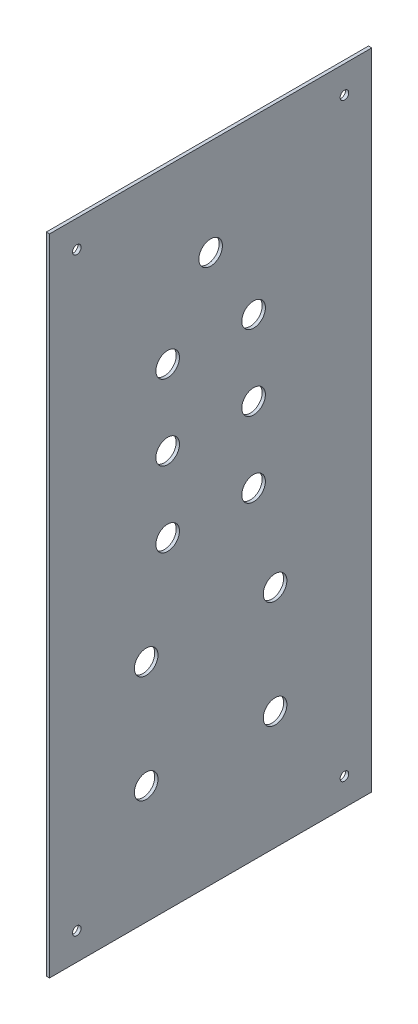
ISO-10303-21;
HEADER;
FILE_DESCRIPTION(('STEP AP214'),'2;1');
FILE_NAME('part.step','',(''),(''),'','','');
FILE_SCHEMA(('AUTOMOTIVE_DESIGN { 1 0 10303 214 1 1 1 1 }'));
ENDSEC;
DATA;
#1=APPLICATION_CONTEXT('core data for automotive mechanical design processes');
#2=APPLICATION_PROTOCOL_DEFINITION('international standard','automotive_design',2000,#1);
#3=PRODUCT_CONTEXT('',#1,'mechanical');
#4=PRODUCT('Part','Part','',(#3));
#5=PRODUCT_RELATED_PRODUCT_CATEGORY('part','',(#4));
#6=PRODUCT_DEFINITION_FORMATION('','',#4);
#7=PRODUCT_DEFINITION_CONTEXT('part definition',#1,'design');
#8=PRODUCT_DEFINITION('design','',#6,#7);
#9=PRODUCT_DEFINITION_SHAPE('','',#8);
#10=(LENGTH_UNIT() NAMED_UNIT(*) SI_UNIT(.MILLI.,.METRE.));
#11=(NAMED_UNIT(*) PLANE_ANGLE_UNIT() SI_UNIT($,.RADIAN.));
#12=(NAMED_UNIT(*) SI_UNIT($,.STERADIAN.) SOLID_ANGLE_UNIT());
#13=UNCERTAINTY_MEASURE_WITH_UNIT(LENGTH_MEASURE(1.E-05),#10,'distance_accuracy_value','');
#14=(GEOMETRIC_REPRESENTATION_CONTEXT(3) GLOBAL_UNCERTAINTY_ASSIGNED_CONTEXT((#13)) GLOBAL_UNIT_ASSIGNED_CONTEXT((#10,
#11,#12)) REPRESENTATION_CONTEXT('',''));
#15=CARTESIAN_POINT('',(0.,0.,0.));
#16=DIRECTION('',(0.,0.,1.));
#17=DIRECTION('',(1.,0.,0.));
#18=AXIS2_PLACEMENT_3D('',#15,#16,#17);
#19=CARTESIAN_POINT('',(0.,0.,0.));
#20=DIRECTION('',(-1.,0.,0.));
#21=DIRECTION('',(0.,0.,1.));
#22=AXIS2_PLACEMENT_3D('',#19,#20,#21);
#23=PLANE('',#22);
#24=CARTESIAN_POINT('',(0.,105.,0.));
#25=DIRECTION('',(1.,0.,0.));
#26=DIRECTION('',(0.,0.,-1.));
#27=AXIS2_PLACEMENT_3D('',#24,#25,#26);
#28=CIRCLE('',#27,5.50000000000001);
#29=CARTESIAN_POINT('',(0.,105.,-5.50000000000001));
#30=VERTEX_POINT('',#29);
#31=EDGE_CURVE('E204',#30,#30,#28,.T.);
#32=ORIENTED_EDGE('',*,*,#31,.T.);
#33=EDGE_LOOP('',(#32));
#34=FACE_BOUND('',#33,.T.);
#35=CARTESIAN_POINT('',(0.,0.,-20.));
#36=DIRECTION('',(1.,0.,0.));
#37=DIRECTION('',(0.,0.,-1.));
#38=AXIS2_PLACEMENT_3D('',#35,#36,#37);
#39=CIRCLE('',#38,5.5);
#40=CARTESIAN_POINT('',(0.,0.,-25.5));
#41=VERTEX_POINT('',#40);
#42=EDGE_CURVE('E199',#41,#41,#39,.T.);
#43=ORIENTED_EDGE('',*,*,#42,.T.);
#44=EDGE_LOOP('',(#43));
#45=FACE_BOUND('',#44,.T.);
#46=DIRECTION('',(0.,0.,1.));
#47=VECTOR('',#46,1.);
#48=CARTESIAN_POINT('',(0.,150.,-75.));
#49=LINE('',#48,#47);
#50=CARTESIAN_POINT('',(0.,150.,-75.));
#51=VERTEX_POINT('',#50);
#52=CARTESIAN_POINT('',(0.,150.,75.));
#53=VERTEX_POINT('',#52);
#54=EDGE_CURVE('E106',#51,#53,#49,.T.);
#55=ORIENTED_EDGE('',*,*,#54,.F.);
#56=DIRECTION('',(0.,1.,0.));
#57=VECTOR('',#56,1.);
#58=CARTESIAN_POINT('',(0.,-150.,-75.));
#59=LINE('',#58,#57);
#60=CARTESIAN_POINT('',(0.,-150.,-75.));
#61=VERTEX_POINT('',#60);
#62=EDGE_CURVE('E85',#61,#51,#59,.T.);
#63=ORIENTED_EDGE('',*,*,#62,.F.);
#64=DIRECTION('',(0.,0.,-1.));
#65=VECTOR('',#64,1.);
#66=CARTESIAN_POINT('',(0.,-150.,-75.));
#67=LINE('',#66,#65);
#68=CARTESIAN_POINT('',(0.,-150.,75.));
#69=VERTEX_POINT('',#68);
#70=EDGE_CURVE('E77',#69,#61,#67,.T.);
#71=ORIENTED_EDGE('',*,*,#70,.F.);
#72=DIRECTION('',(0.,-1.,0.));
#73=VECTOR('',#72,1.);
#74=CARTESIAN_POINT('',(0.,-150.,75.));
#75=LINE('',#74,#73);
#76=EDGE_CURVE('E96',#53,#69,#75,.T.);
#77=ORIENTED_EDGE('',*,*,#76,.F.);
#78=EDGE_LOOP('',(#55,#63,#71,#77));
#79=FACE_BOUND('',#78,.T.);
#80=CARTESIAN_POINT('',(0.,-137.3,62.3));
#81=DIRECTION('',(1.,0.,0.));
#82=DIRECTION('',(0.,0.,-1.));
#83=AXIS2_PLACEMENT_3D('',#80,#81,#82);
#84=CIRCLE('',#83,2.);
#85=CARTESIAN_POINT('',(0.,-137.3,60.3));
#86=VERTEX_POINT('',#85);
#87=EDGE_CURVE('E107',#86,#86,#84,.T.);
#88=ORIENTED_EDGE('',*,*,#87,.T.);
#89=EDGE_LOOP('',(#88));
#90=FACE_BOUND('',#89,.T.);
#91=CARTESIAN_POINT('',(0.,-137.3,-62.3));
#92=DIRECTION('',(1.,0.,0.));
#93=DIRECTION('',(0.,0.,-1.));
#94=AXIS2_PLACEMENT_3D('',#91,#92,#93);
#95=CIRCLE('',#94,2.);
#96=CARTESIAN_POINT('',(0.,-137.3,-64.3));
#97=VERTEX_POINT('',#96);
#98=EDGE_CURVE('E123',#97,#97,#95,.T.);
#99=ORIENTED_EDGE('',*,*,#98,.T.);
#100=EDGE_LOOP('',(#99));
#101=FACE_BOUND('',#100,.T.);
#102=CARTESIAN_POINT('',(0.,137.3,62.3));
#103=DIRECTION('',(1.,0.,0.));
#104=DIRECTION('',(0.,0.,-1.));
#105=AXIS2_PLACEMENT_3D('',#102,#103,#104);
#106=CIRCLE('',#105,2.);
#107=CARTESIAN_POINT('',(0.,137.3,60.3));
#108=VERTEX_POINT('',#107);
#109=EDGE_CURVE('E133',#108,#108,#106,.T.);
#110=ORIENTED_EDGE('',*,*,#109,.T.);
#111=EDGE_LOOP('',(#110));
#112=FACE_BOUND('',#111,.T.);
#113=CARTESIAN_POINT('',(0.,137.3,-62.3));
#114=DIRECTION('',(1.,0.,0.));
#115=DIRECTION('',(0.,0.,-1.));
#116=AXIS2_PLACEMENT_3D('',#113,#114,#115);
#117=CIRCLE('',#116,2.);
#118=CARTESIAN_POINT('',(0.,137.3,-64.3));
#119=VERTEX_POINT('',#118);
#120=EDGE_CURVE('E137',#119,#119,#117,.T.);
#121=ORIENTED_EDGE('',*,*,#120,.T.);
#122=EDGE_LOOP('',(#121));
#123=FACE_BOUND('',#122,.T.);
#124=CARTESIAN_POINT('',(0.,-45.,30.));
#125=DIRECTION('',(1.,0.,0.));
#126=DIRECTION('',(0.,0.,-1.));
#127=AXIS2_PLACEMENT_3D('',#124,#125,#126);
#128=CIRCLE('',#127,5.5);
#129=CARTESIAN_POINT('',(0.,-45.,24.5));
#130=VERTEX_POINT('',#129);
#131=EDGE_CURVE('E141',#130,#130,#128,.T.);
#132=ORIENTED_EDGE('',*,*,#131,.T.);
#133=EDGE_LOOP('',(#132));
#134=FACE_BOUND('',#133,.T.);
#135=CARTESIAN_POINT('',(0.,-95.,30.));
#136=DIRECTION('',(1.,0.,0.));
#137=DIRECTION('',(0.,0.,-1.));
#138=AXIS2_PLACEMENT_3D('',#135,#136,#137);
#139=CIRCLE('',#138,5.50000000000001);
#140=CARTESIAN_POINT('',(0.,-95.,24.5));
#141=VERTEX_POINT('',#140);
#142=EDGE_CURVE('E146',#141,#141,#139,.T.);
#143=ORIENTED_EDGE('',*,*,#142,.T.);
#144=EDGE_LOOP('',(#143));
#145=FACE_BOUND('',#144,.T.);
#146=CARTESIAN_POINT('',(0.,-45.,-30.));
#147=DIRECTION('',(1.,0.,0.));
#148=DIRECTION('',(0.,0.,-1.));
#149=AXIS2_PLACEMENT_3D('',#146,#147,#148);
#150=CIRCLE('',#149,5.5);
#151=CARTESIAN_POINT('',(0.,-45.,-35.5));
#152=VERTEX_POINT('',#151);
#153=EDGE_CURVE('E151',#152,#152,#150,.T.);
#154=ORIENTED_EDGE('',*,*,#153,.T.);
#155=EDGE_LOOP('',(#154));
#156=FACE_BOUND('',#155,.T.);
#157=CARTESIAN_POINT('',(0.,-95.,-30.));
#158=DIRECTION('',(1.,0.,0.));
#159=DIRECTION('',(0.,0.,-1.));
#160=AXIS2_PLACEMENT_3D('',#157,#158,#159);
#161=CIRCLE('',#160,5.50000000000001);
#162=CARTESIAN_POINT('',(0.,-95.,-35.5));
#163=VERTEX_POINT('',#162);
#164=EDGE_CURVE('E163',#163,#163,#161,.T.);
#165=ORIENTED_EDGE('',*,*,#164,.T.);
#166=EDGE_LOOP('',(#165));
#167=FACE_BOUND('',#166,.T.);
#168=CARTESIAN_POINT('',(0.,70.,20.));
#169=DIRECTION('',(1.,0.,0.));
#170=DIRECTION('',(0.,0.,-1.));
#171=AXIS2_PLACEMENT_3D('',#168,#169,#170);
#172=CIRCLE('',#171,5.50000000000001);
#173=CARTESIAN_POINT('',(0.,70.,14.5));
#174=VERTEX_POINT('',#173);
#175=EDGE_CURVE('E170',#174,#174,#172,.T.);
#176=ORIENTED_EDGE('',*,*,#175,.T.);
#177=EDGE_LOOP('',(#176));
#178=FACE_BOUND('',#177,.T.);
#179=CARTESIAN_POINT('',(0.,35.,20.));
#180=DIRECTION('',(1.,0.,0.));
#181=DIRECTION('',(0.,0.,-1.));
#182=AXIS2_PLACEMENT_3D('',#179,#180,#181);
#183=CIRCLE('',#182,5.5);
#184=CARTESIAN_POINT('',(0.,35.,14.5));
#185=VERTEX_POINT('',#184);
#186=EDGE_CURVE('E173',#185,#185,#183,.T.);
#187=ORIENTED_EDGE('',*,*,#186,.T.);
#188=EDGE_LOOP('',(#187));
#189=FACE_BOUND('',#188,.T.);
#190=CARTESIAN_POINT('',(0.,0.,20.));
#191=DIRECTION('',(1.,0.,0.));
#192=DIRECTION('',(0.,0.,-1.));
#193=AXIS2_PLACEMENT_3D('',#190,#191,#192);
#194=CIRCLE('',#193,5.5);
#195=CARTESIAN_POINT('',(0.,0.,14.5));
#196=VERTEX_POINT('',#195);
#197=EDGE_CURVE('E177',#196,#196,#194,.T.);
#198=ORIENTED_EDGE('',*,*,#197,.T.);
#199=EDGE_LOOP('',(#198));
#200=FACE_BOUND('',#199,.T.);
#201=CARTESIAN_POINT('',(0.,70.,-20.));
#202=DIRECTION('',(1.,0.,0.));
#203=DIRECTION('',(0.,0.,-1.));
#204=AXIS2_PLACEMENT_3D('',#201,#202,#203);
#205=CIRCLE('',#204,5.50000000000001);
#206=CARTESIAN_POINT('',(0.,70.,-25.5));
#207=VERTEX_POINT('',#206);
#208=EDGE_CURVE('E184',#207,#207,#205,.T.);
#209=ORIENTED_EDGE('',*,*,#208,.T.);
#210=EDGE_LOOP('',(#209));
#211=FACE_BOUND('',#210,.T.);
#212=CARTESIAN_POINT('',(0.,35.,-20.));
#213=DIRECTION('',(1.,0.,0.));
#214=DIRECTION('',(0.,0.,-1.));
#215=AXIS2_PLACEMENT_3D('',#212,#213,#214);
#216=CIRCLE('',#215,5.5);
#217=CARTESIAN_POINT('',(0.,35.,-25.5));
#218=VERTEX_POINT('',#217);
#219=EDGE_CURVE('E192',#218,#218,#216,.T.);
#220=ORIENTED_EDGE('',*,*,#219,.T.);
#221=EDGE_LOOP('',(#220));
#222=FACE_BOUND('',#221,.T.);
#223=ADVANCED_FACE('F45',(#34,#45,#79,#90,#101,#112,#123,#134,#145,#156,#167,#178,#189,#200,
#211,#222),#23,.T.);
#224=CARTESIAN_POINT('',(1.52,150.,-75.));
#225=DIRECTION('',(0.,-1.,0.));
#226=DIRECTION('',(0.,0.,-1.));
#227=AXIS2_PLACEMENT_3D('',#224,#225,#226);
#228=PLANE('',#227);
#229=ORIENTED_EDGE('',*,*,#54,.T.);
#230=DIRECTION('',(-1.,0.,0.));
#231=VECTOR('',#230,1.);
#232=CARTESIAN_POINT('',(1.52,150.,75.));
#233=LINE('',#232,#231);
#234=CARTESIAN_POINT('',(1.52,150.,75.));
#235=VERTEX_POINT('',#234);
#236=EDGE_CURVE('E11',#235,#53,#233,.T.);
#237=ORIENTED_EDGE('',*,*,#236,.F.);
#238=DIRECTION('',(0.,0.,1.));
#239=VECTOR('',#238,1.);
#240=CARTESIAN_POINT('',(1.52,150.,-75.));
#241=LINE('',#240,#239);
#242=CARTESIAN_POINT('',(1.52,150.,-75.));
#243=VERTEX_POINT('',#242);
#244=EDGE_CURVE('E93',#243,#235,#241,.T.);
#245=ORIENTED_EDGE('',*,*,#244,.F.);
#246=DIRECTION('',(-1.,0.,0.));
#247=VECTOR('',#246,1.);
#248=CARTESIAN_POINT('',(1.52,150.,-75.));
#249=LINE('',#248,#247);
#250=EDGE_CURVE('E105',#243,#51,#249,.T.);
#251=ORIENTED_EDGE('',*,*,#250,.T.);
#252=EDGE_LOOP('',(#229,#237,#245,#251));
#253=FACE_BOUND('',#252,.T.);
#254=ADVANCED_FACE('F42',(#253),#228,.F.);
#255=CARTESIAN_POINT('',(1.52,-150.,75.));
#256=DIRECTION('',(0.,0.,-1.));
#257=DIRECTION('',(-1.,0.,0.));
#258=AXIS2_PLACEMENT_3D('',#255,#256,#257);
#259=PLANE('',#258);
#260=ORIENTED_EDGE('',*,*,#76,.T.);
#261=DIRECTION('',(-1.,0.,0.));
#262=VECTOR('',#261,1.);
#263=CARTESIAN_POINT('',(1.52,-150.,75.));
#264=LINE('',#263,#262);
#265=CARTESIAN_POINT('',(1.52,-150.,75.));
#266=VERTEX_POINT('',#265);
#267=EDGE_CURVE('E51',#266,#69,#264,.T.);
#268=ORIENTED_EDGE('',*,*,#267,.F.);
#269=DIRECTION('',(0.,-1.,0.));
#270=VECTOR('',#269,1.);
#271=CARTESIAN_POINT('',(1.52,-150.,75.));
#272=LINE('',#271,#270);
#273=EDGE_CURVE('E90',#235,#266,#272,.T.);
#274=ORIENTED_EDGE('',*,*,#273,.F.);
#275=ORIENTED_EDGE('',*,*,#236,.T.);
#276=EDGE_LOOP('',(#260,#268,#274,#275));
#277=FACE_BOUND('',#276,.T.);
#278=ADVANCED_FACE('F97',(#277),#259,.F.);
#279=CARTESIAN_POINT('',(1.52,-150.,-75.));
#280=DIRECTION('',(0.,1.,0.));
#281=DIRECTION('',(0.,0.,1.));
#282=AXIS2_PLACEMENT_3D('',#279,#280,#281);
#283=PLANE('',#282);
#284=ORIENTED_EDGE('',*,*,#70,.T.);
#285=DIRECTION('',(-1.,0.,0.));
#286=VECTOR('',#285,1.);
#287=CARTESIAN_POINT('',(1.52,-150.,-75.));
#288=LINE('',#287,#286);
#289=CARTESIAN_POINT('',(1.52,-150.,-75.));
#290=VERTEX_POINT('',#289);
#291=EDGE_CURVE('E100',#290,#61,#288,.T.);
#292=ORIENTED_EDGE('',*,*,#291,.F.);
#293=DIRECTION('',(0.,0.,-1.));
#294=VECTOR('',#293,1.);
#295=CARTESIAN_POINT('',(1.52,-150.,-75.));
#296=LINE('',#295,#294);
#297=EDGE_CURVE('E95',#266,#290,#296,.T.);
#298=ORIENTED_EDGE('',*,*,#297,.F.);
#299=ORIENTED_EDGE('',*,*,#267,.T.);
#300=EDGE_LOOP('',(#284,#292,#298,#299));
#301=FACE_BOUND('',#300,.T.);
#302=ADVANCED_FACE('F99',(#301),#283,.F.);
#303=CARTESIAN_POINT('',(1.52,-150.,-75.));
#304=DIRECTION('',(0.,0.,1.));
#305=DIRECTION('',(1.,0.,0.));
#306=AXIS2_PLACEMENT_3D('',#303,#304,#305);
#307=PLANE('',#306);
#308=ORIENTED_EDGE('',*,*,#62,.T.);
#309=ORIENTED_EDGE('',*,*,#250,.F.);
#310=DIRECTION('',(0.,1.,0.));
#311=VECTOR('',#310,1.);
#312=CARTESIAN_POINT('',(1.52,-150.,-75.));
#313=LINE('',#312,#311);
#314=EDGE_CURVE('E56',#290,#243,#313,.T.);
#315=ORIENTED_EDGE('',*,*,#314,.F.);
#316=ORIENTED_EDGE('',*,*,#291,.T.);
#317=EDGE_LOOP('',(#308,#309,#315,#316));
#318=FACE_BOUND('',#317,.T.);
#319=ADVANCED_FACE('F112',(#318),#307,.F.);
#320=CARTESIAN_POINT('',(1.52,0.,0.));
#321=DIRECTION('',(-1.,0.,0.));
#322=DIRECTION('',(0.,0.,1.));
#323=AXIS2_PLACEMENT_3D('',#320,#321,#322);
#324=PLANE('',#323);
#325=CARTESIAN_POINT('',(1.52,105.,0.));
#326=DIRECTION('',(1.,0.,0.));
#327=DIRECTION('',(0.,0.,-1.));
#328=AXIS2_PLACEMENT_3D('',#325,#326,#327);
#329=CIRCLE('',#328,5.50000000000001);
#330=CARTESIAN_POINT('',(1.52,105.,-5.50000000000001));
#331=VERTEX_POINT('',#330);
#332=EDGE_CURVE('E207',#331,#331,#329,.T.);
#333=ORIENTED_EDGE('',*,*,#332,.F.);
#334=EDGE_LOOP('',(#333));
#335=FACE_BOUND('',#334,.T.);
#336=CARTESIAN_POINT('',(1.52,0.,-20.));
#337=DIRECTION('',(1.,0.,0.));
#338=DIRECTION('',(0.,0.,-1.));
#339=AXIS2_PLACEMENT_3D('',#336,#337,#338);
#340=CIRCLE('',#339,5.5);
#341=CARTESIAN_POINT('',(1.52,0.,-25.5));
#342=VERTEX_POINT('',#341);
#343=EDGE_CURVE('E196',#342,#342,#340,.T.);
#344=ORIENTED_EDGE('',*,*,#343,.F.);
#345=EDGE_LOOP('',(#344));
#346=FACE_BOUND('',#345,.T.);
#347=CARTESIAN_POINT('',(1.52,35.,-20.));
#348=DIRECTION('',(1.,0.,0.));
#349=DIRECTION('',(0.,0.,-1.));
#350=AXIS2_PLACEMENT_3D('',#347,#348,#349);
#351=CIRCLE('',#350,5.5);
#352=CARTESIAN_POINT('',(1.52,35.,-25.5));
#353=VERTEX_POINT('',#352);
#354=EDGE_CURVE('E191',#353,#353,#351,.T.);
#355=ORIENTED_EDGE('',*,*,#354,.F.);
#356=EDGE_LOOP('',(#355));
#357=FACE_BOUND('',#356,.T.);
#358=CARTESIAN_POINT('',(1.52,70.,-20.));
#359=DIRECTION('',(1.,0.,0.));
#360=DIRECTION('',(0.,0.,-1.));
#361=AXIS2_PLACEMENT_3D('',#358,#359,#360);
#362=CIRCLE('',#361,5.50000000000001);
#363=CARTESIAN_POINT('',(1.52,70.,-25.5));
#364=VERTEX_POINT('',#363);
#365=EDGE_CURVE('E189',#364,#364,#362,.T.);
#366=ORIENTED_EDGE('',*,*,#365,.F.);
#367=EDGE_LOOP('',(#366));
#368=FACE_BOUND('',#367,.T.);
#369=CARTESIAN_POINT('',(1.52,0.,20.));
#370=DIRECTION('',(1.,0.,0.));
#371=DIRECTION('',(0.,0.,-1.));
#372=AXIS2_PLACEMENT_3D('',#369,#370,#371);
#373=CIRCLE('',#372,5.5);
#374=CARTESIAN_POINT('',(1.52,0.,14.5));
#375=VERTEX_POINT('',#374);
#376=EDGE_CURVE('E185',#375,#375,#373,.T.);
#377=ORIENTED_EDGE('',*,*,#376,.F.);
#378=EDGE_LOOP('',(#377));
#379=FACE_BOUND('',#378,.T.);
#380=CARTESIAN_POINT('',(1.52,35.,20.));
#381=DIRECTION('',(1.,0.,0.));
#382=DIRECTION('',(0.,0.,-1.));
#383=AXIS2_PLACEMENT_3D('',#380,#381,#382);
#384=CIRCLE('',#383,5.5);
#385=CARTESIAN_POINT('',(1.52,35.,14.5));
#386=VERTEX_POINT('',#385);
#387=EDGE_CURVE('E176',#386,#386,#384,.T.);
#388=ORIENTED_EDGE('',*,*,#387,.F.);
#389=EDGE_LOOP('',(#388));
#390=FACE_BOUND('',#389,.T.);
#391=CARTESIAN_POINT('',(1.52,70.,20.));
#392=DIRECTION('',(1.,0.,0.));
#393=DIRECTION('',(0.,0.,-1.));
#394=AXIS2_PLACEMENT_3D('',#391,#392,#393);
#395=CIRCLE('',#394,5.50000000000001);
#396=CARTESIAN_POINT('',(1.52,70.,14.5));
#397=VERTEX_POINT('',#396);
#398=EDGE_CURVE('E167',#397,#397,#395,.T.);
#399=ORIENTED_EDGE('',*,*,#398,.F.);
#400=EDGE_LOOP('',(#399));
#401=FACE_BOUND('',#400,.T.);
#402=CARTESIAN_POINT('',(1.52,-95.,-30.));
#403=DIRECTION('',(1.,0.,0.));
#404=DIRECTION('',(0.,0.,-1.));
#405=AXIS2_PLACEMENT_3D('',#402,#403,#404);
#406=CIRCLE('',#405,5.50000000000001);
#407=CARTESIAN_POINT('',(1.52,-95.,-35.5));
#408=VERTEX_POINT('',#407);
#409=EDGE_CURVE('E165',#408,#408,#406,.T.);
#410=ORIENTED_EDGE('',*,*,#409,.F.);
#411=EDGE_LOOP('',(#410));
#412=FACE_BOUND('',#411,.T.);
#413=CARTESIAN_POINT('',(1.52,-45.,-30.));
#414=DIRECTION('',(1.,0.,0.));
#415=DIRECTION('',(0.,0.,-1.));
#416=AXIS2_PLACEMENT_3D('',#413,#414,#415);
#417=CIRCLE('',#416,5.5);
#418=CARTESIAN_POINT('',(1.52,-45.,-35.5));
#419=VERTEX_POINT('',#418);
#420=EDGE_CURVE('E157',#419,#419,#417,.T.);
#421=ORIENTED_EDGE('',*,*,#420,.F.);
#422=EDGE_LOOP('',(#421));
#423=FACE_BOUND('',#422,.T.);
#424=CARTESIAN_POINT('',(1.52,-95.,30.));
#425=DIRECTION('',(1.,0.,0.));
#426=DIRECTION('',(0.,0.,-1.));
#427=AXIS2_PLACEMENT_3D('',#424,#425,#426);
#428=CIRCLE('',#427,5.50000000000001);
#429=CARTESIAN_POINT('',(1.52,-95.,24.5));
#430=VERTEX_POINT('',#429);
#431=EDGE_CURVE('E154',#430,#430,#428,.T.);
#432=ORIENTED_EDGE('',*,*,#431,.F.);
#433=EDGE_LOOP('',(#432));
#434=FACE_BOUND('',#433,.T.);
#435=CARTESIAN_POINT('',(1.52,-45.,30.));
#436=DIRECTION('',(1.,0.,0.));
#437=DIRECTION('',(0.,0.,-1.));
#438=AXIS2_PLACEMENT_3D('',#435,#436,#437);
#439=CIRCLE('',#438,5.5);
#440=CARTESIAN_POINT('',(1.52,-45.,24.5));
#441=VERTEX_POINT('',#440);
#442=EDGE_CURVE('E147',#441,#441,#439,.T.);
#443=ORIENTED_EDGE('',*,*,#442,.F.);
#444=EDGE_LOOP('',(#443));
#445=FACE_BOUND('',#444,.T.);
#446=CARTESIAN_POINT('',(1.52,137.3,-62.3));
#447=DIRECTION('',(1.,0.,0.));
#448=DIRECTION('',(0.,0.,-1.));
#449=AXIS2_PLACEMENT_3D('',#446,#447,#448);
#450=CIRCLE('',#449,1.99999999999997);
#451=CARTESIAN_POINT('',(1.52,137.3,-64.3));
#452=VERTEX_POINT('',#451);
#453=EDGE_CURVE('E140',#452,#452,#450,.T.);
#454=ORIENTED_EDGE('',*,*,#453,.F.);
#455=EDGE_LOOP('',(#454));
#456=FACE_BOUND('',#455,.T.);
#457=CARTESIAN_POINT('',(1.52,137.3,62.3));
#458=DIRECTION('',(1.,0.,0.));
#459=DIRECTION('',(0.,0.,-1.));
#460=AXIS2_PLACEMENT_3D('',#457,#458,#459);
#461=CIRCLE('',#460,1.99999999999997);
#462=CARTESIAN_POINT('',(1.52,137.3,60.3));
#463=VERTEX_POINT('',#462);
#464=EDGE_CURVE('E135',#463,#463,#461,.T.);
#465=ORIENTED_EDGE('',*,*,#464,.F.);
#466=EDGE_LOOP('',(#465));
#467=FACE_BOUND('',#466,.T.);
#468=CARTESIAN_POINT('',(1.52,-137.3,-62.3));
#469=DIRECTION('',(1.,0.,0.));
#470=DIRECTION('',(0.,0.,-1.));
#471=AXIS2_PLACEMENT_3D('',#468,#469,#470);
#472=CIRCLE('',#471,1.99999999999997);
#473=CARTESIAN_POINT('',(1.52,-137.3,-64.3));
#474=VERTEX_POINT('',#473);
#475=EDGE_CURVE('E129',#474,#474,#472,.T.);
#476=ORIENTED_EDGE('',*,*,#475,.F.);
#477=EDGE_LOOP('',(#476));
#478=FACE_BOUND('',#477,.T.);
#479=CARTESIAN_POINT('',(1.52,-137.3,62.3));
#480=DIRECTION('',(1.,0.,0.));
#481=DIRECTION('',(0.,0.,-1.));
#482=AXIS2_PLACEMENT_3D('',#479,#480,#481);
#483=CIRCLE('',#482,1.99999999999997);
#484=CARTESIAN_POINT('',(1.52,-137.3,60.3));
#485=VERTEX_POINT('',#484);
#486=EDGE_CURVE('E125',#485,#485,#483,.T.);
#487=ORIENTED_EDGE('',*,*,#486,.F.);
#488=EDGE_LOOP('',(#487));
#489=FACE_BOUND('',#488,.T.);
#490=ORIENTED_EDGE('',*,*,#244,.T.);
#491=ORIENTED_EDGE('',*,*,#273,.T.);
#492=ORIENTED_EDGE('',*,*,#297,.T.);
#493=ORIENTED_EDGE('',*,*,#314,.T.);
#494=EDGE_LOOP('',(#490,#491,#492,#493));
#495=FACE_BOUND('',#494,.T.);
#496=ADVANCED_FACE('F86',(#335,#346,#357,#368,#379,#390,#401,#412,#423,#434,#445,#456,#467,#478,
#489,#495),#324,.F.);
#497=CARTESIAN_POINT('',(1.52,-137.3,62.3));
#498=DIRECTION('',(1.,0.,0.));
#499=DIRECTION('',(0.,0.,-1.));
#500=AXIS2_PLACEMENT_3D('',#497,#498,#499);
#501=CYLINDRICAL_SURFACE('',#500,1.99999999999999);
#502=ORIENTED_EDGE('',*,*,#87,.F.);
#503=EDGE_LOOP('',(#502));
#504=FACE_BOUND('',#503,.T.);
#505=ORIENTED_EDGE('',*,*,#486,.T.);
#506=EDGE_LOOP('',(#505));
#507=FACE_BOUND('',#506,.T.);
#508=ADVANCED_FACE('F211',(#504,#507),#501,.F.);
#509=CARTESIAN_POINT('',(1.52,-137.3,-62.3));
#510=DIRECTION('',(1.,0.,0.));
#511=DIRECTION('',(0.,0.,-1.));
#512=AXIS2_PLACEMENT_3D('',#509,#510,#511);
#513=CYLINDRICAL_SURFACE('',#512,1.99999999999999);
#514=ORIENTED_EDGE('',*,*,#98,.F.);
#515=EDGE_LOOP('',(#514));
#516=FACE_BOUND('',#515,.T.);
#517=ORIENTED_EDGE('',*,*,#475,.T.);
#518=EDGE_LOOP('',(#517));
#519=FACE_BOUND('',#518,.T.);
#520=ADVANCED_FACE('F244',(#516,#519),#513,.F.);
#521=CARTESIAN_POINT('',(1.52,137.3,62.3));
#522=DIRECTION('',(1.,0.,0.));
#523=DIRECTION('',(0.,0.,-1.));
#524=AXIS2_PLACEMENT_3D('',#521,#522,#523);
#525=CYLINDRICAL_SURFACE('',#524,1.99999999999999);
#526=ORIENTED_EDGE('',*,*,#109,.F.);
#527=EDGE_LOOP('',(#526));
#528=FACE_BOUND('',#527,.T.);
#529=ORIENTED_EDGE('',*,*,#464,.T.);
#530=EDGE_LOOP('',(#529));
#531=FACE_BOUND('',#530,.T.);
#532=ADVANCED_FACE('F255',(#528,#531),#525,.F.);
#533=CARTESIAN_POINT('',(1.52,137.3,-62.3));
#534=DIRECTION('',(1.,0.,0.));
#535=DIRECTION('',(0.,0.,-1.));
#536=AXIS2_PLACEMENT_3D('',#533,#534,#535);
#537=CYLINDRICAL_SURFACE('',#536,1.99999999999999);
#538=ORIENTED_EDGE('',*,*,#120,.F.);
#539=EDGE_LOOP('',(#538));
#540=FACE_BOUND('',#539,.T.);
#541=ORIENTED_EDGE('',*,*,#453,.T.);
#542=EDGE_LOOP('',(#541));
#543=FACE_BOUND('',#542,.T.);
#544=ADVANCED_FACE('F307',(#540,#543),#537,.F.);
#545=CARTESIAN_POINT('',(1.52,-45.,30.));
#546=DIRECTION('',(1.,0.,0.));
#547=DIRECTION('',(0.,0.,-1.));
#548=AXIS2_PLACEMENT_3D('',#545,#546,#547);
#549=CYLINDRICAL_SURFACE('',#548,5.5);
#550=ORIENTED_EDGE('',*,*,#131,.F.);
#551=EDGE_LOOP('',(#550));
#552=FACE_BOUND('',#551,.T.);
#553=ORIENTED_EDGE('',*,*,#442,.T.);
#554=EDGE_LOOP('',(#553));
#555=FACE_BOUND('',#554,.T.);
#556=ADVANCED_FACE('F316',(#552,#555),#549,.F.);
#557=CARTESIAN_POINT('',(1.52,-95.,30.));
#558=DIRECTION('',(1.,0.,0.));
#559=DIRECTION('',(0.,0.,-1.));
#560=AXIS2_PLACEMENT_3D('',#557,#558,#559);
#561=CYLINDRICAL_SURFACE('',#560,5.50000000000001);
#562=ORIENTED_EDGE('',*,*,#142,.F.);
#563=EDGE_LOOP('',(#562));
#564=FACE_BOUND('',#563,.T.);
#565=ORIENTED_EDGE('',*,*,#431,.T.);
#566=EDGE_LOOP('',(#565));
#567=FACE_BOUND('',#566,.T.);
#568=ADVANCED_FACE('F330',(#564,#567),#561,.F.);
#569=CARTESIAN_POINT('',(1.52,-45.,-30.));
#570=DIRECTION('',(1.,0.,0.));
#571=DIRECTION('',(0.,0.,-1.));
#572=AXIS2_PLACEMENT_3D('',#569,#570,#571);
#573=CYLINDRICAL_SURFACE('',#572,5.5);
#574=ORIENTED_EDGE('',*,*,#153,.F.);
#575=EDGE_LOOP('',(#574));
#576=FACE_BOUND('',#575,.T.);
#577=ORIENTED_EDGE('',*,*,#420,.T.);
#578=EDGE_LOOP('',(#577));
#579=FACE_BOUND('',#578,.T.);
#580=ADVANCED_FACE('F339',(#576,#579),#573,.F.);
#581=CARTESIAN_POINT('',(1.52,-95.,-30.));
#582=DIRECTION('',(1.,0.,0.));
#583=DIRECTION('',(0.,0.,-1.));
#584=AXIS2_PLACEMENT_3D('',#581,#582,#583);
#585=CYLINDRICAL_SURFACE('',#584,5.50000000000001);
#586=ORIENTED_EDGE('',*,*,#164,.F.);
#587=EDGE_LOOP('',(#586));
#588=FACE_BOUND('',#587,.T.);
#589=ORIENTED_EDGE('',*,*,#409,.T.);
#590=EDGE_LOOP('',(#589));
#591=FACE_BOUND('',#590,.T.);
#592=ADVANCED_FACE('F350',(#588,#591),#585,.F.);
#593=CARTESIAN_POINT('',(1.52,70.,20.));
#594=DIRECTION('',(1.,0.,0.));
#595=DIRECTION('',(0.,0.,-1.));
#596=AXIS2_PLACEMENT_3D('',#593,#594,#595);
#597=CYLINDRICAL_SURFACE('',#596,5.50000000000001);
#598=ORIENTED_EDGE('',*,*,#175,.F.);
#599=EDGE_LOOP('',(#598));
#600=FACE_BOUND('',#599,.T.);
#601=ORIENTED_EDGE('',*,*,#398,.T.);
#602=EDGE_LOOP('',(#601));
#603=FACE_BOUND('',#602,.T.);
#604=ADVANCED_FACE('F360',(#600,#603),#597,.F.);
#605=CARTESIAN_POINT('',(1.52,35.,20.));
#606=DIRECTION('',(1.,0.,0.));
#607=DIRECTION('',(0.,0.,-1.));
#608=AXIS2_PLACEMENT_3D('',#605,#606,#607);
#609=CYLINDRICAL_SURFACE('',#608,5.5);
#610=ORIENTED_EDGE('',*,*,#186,.F.);
#611=EDGE_LOOP('',(#610));
#612=FACE_BOUND('',#611,.T.);
#613=ORIENTED_EDGE('',*,*,#387,.T.);
#614=EDGE_LOOP('',(#613));
#615=FACE_BOUND('',#614,.T.);
#616=ADVANCED_FACE('F367',(#612,#615),#609,.F.);
#617=CARTESIAN_POINT('',(1.52,0.,20.));
#618=DIRECTION('',(1.,0.,0.));
#619=DIRECTION('',(0.,0.,-1.));
#620=AXIS2_PLACEMENT_3D('',#617,#618,#619);
#621=CYLINDRICAL_SURFACE('',#620,5.5);
#622=ORIENTED_EDGE('',*,*,#197,.F.);
#623=EDGE_LOOP('',(#622));
#624=FACE_BOUND('',#623,.T.);
#625=ORIENTED_EDGE('',*,*,#376,.T.);
#626=EDGE_LOOP('',(#625));
#627=FACE_BOUND('',#626,.T.);
#628=ADVANCED_FACE('F378',(#624,#627),#621,.F.);
#629=CARTESIAN_POINT('',(1.52,70.,-20.));
#630=DIRECTION('',(1.,0.,0.));
#631=DIRECTION('',(0.,0.,-1.));
#632=AXIS2_PLACEMENT_3D('',#629,#630,#631);
#633=CYLINDRICAL_SURFACE('',#632,5.50000000000001);
#634=ORIENTED_EDGE('',*,*,#208,.F.);
#635=EDGE_LOOP('',(#634));
#636=FACE_BOUND('',#635,.T.);
#637=ORIENTED_EDGE('',*,*,#365,.T.);
#638=EDGE_LOOP('',(#637));
#639=FACE_BOUND('',#638,.T.);
#640=ADVANCED_FACE('F386',(#636,#639),#633,.F.);
#641=CARTESIAN_POINT('',(1.52,35.,-20.));
#642=DIRECTION('',(1.,0.,0.));
#643=DIRECTION('',(0.,0.,-1.));
#644=AXIS2_PLACEMENT_3D('',#641,#642,#643);
#645=CYLINDRICAL_SURFACE('',#644,5.5);
#646=ORIENTED_EDGE('',*,*,#219,.F.);
#647=EDGE_LOOP('',(#646));
#648=FACE_BOUND('',#647,.T.);
#649=ORIENTED_EDGE('',*,*,#354,.T.);
#650=EDGE_LOOP('',(#649));
#651=FACE_BOUND('',#650,.T.);
#652=ADVANCED_FACE('F401',(#648,#651),#645,.F.);
#653=CARTESIAN_POINT('',(1.52,0.,-20.));
#654=DIRECTION('',(1.,0.,0.));
#655=DIRECTION('',(0.,0.,-1.));
#656=AXIS2_PLACEMENT_3D('',#653,#654,#655);
#657=CYLINDRICAL_SURFACE('',#656,5.5);
#658=ORIENTED_EDGE('',*,*,#42,.F.);
#659=EDGE_LOOP('',(#658));
#660=FACE_BOUND('',#659,.T.);
#661=ORIENTED_EDGE('',*,*,#343,.T.);
#662=EDGE_LOOP('',(#661));
#663=FACE_BOUND('',#662,.T.);
#664=ADVANCED_FACE('F412',(#660,#663),#657,.F.);
#665=CARTESIAN_POINT('',(1.52,105.,0.));
#666=DIRECTION('',(1.,0.,0.));
#667=DIRECTION('',(0.,0.,-1.));
#668=AXIS2_PLACEMENT_3D('',#665,#666,#667);
#669=CYLINDRICAL_SURFACE('',#668,5.50000000000001);
#670=ORIENTED_EDGE('',*,*,#31,.F.);
#671=EDGE_LOOP('',(#670));
#672=FACE_BOUND('',#671,.T.);
#673=ORIENTED_EDGE('',*,*,#332,.T.);
#674=EDGE_LOOP('',(#673));
#675=FACE_BOUND('',#674,.T.);
#676=ADVANCED_FACE('F208',(#672,#675),#669,.F.);
#677=CLOSED_SHELL('',(#223,#254,#278,#302,#319,#496,#508,#520,#532,#544,#556,#568,#580,#592,
#604,#616,#628,#640,#652,#664,#676));
#678=MANIFOLD_SOLID_BREP('B2',#677);
#679=ADVANCED_BREP_SHAPE_REPRESENTATION('',(#18,#678),#14);
#680=SHAPE_DEFINITION_REPRESENTATION(#9,#679);
ENDSEC;
END-ISO-10303-21;
